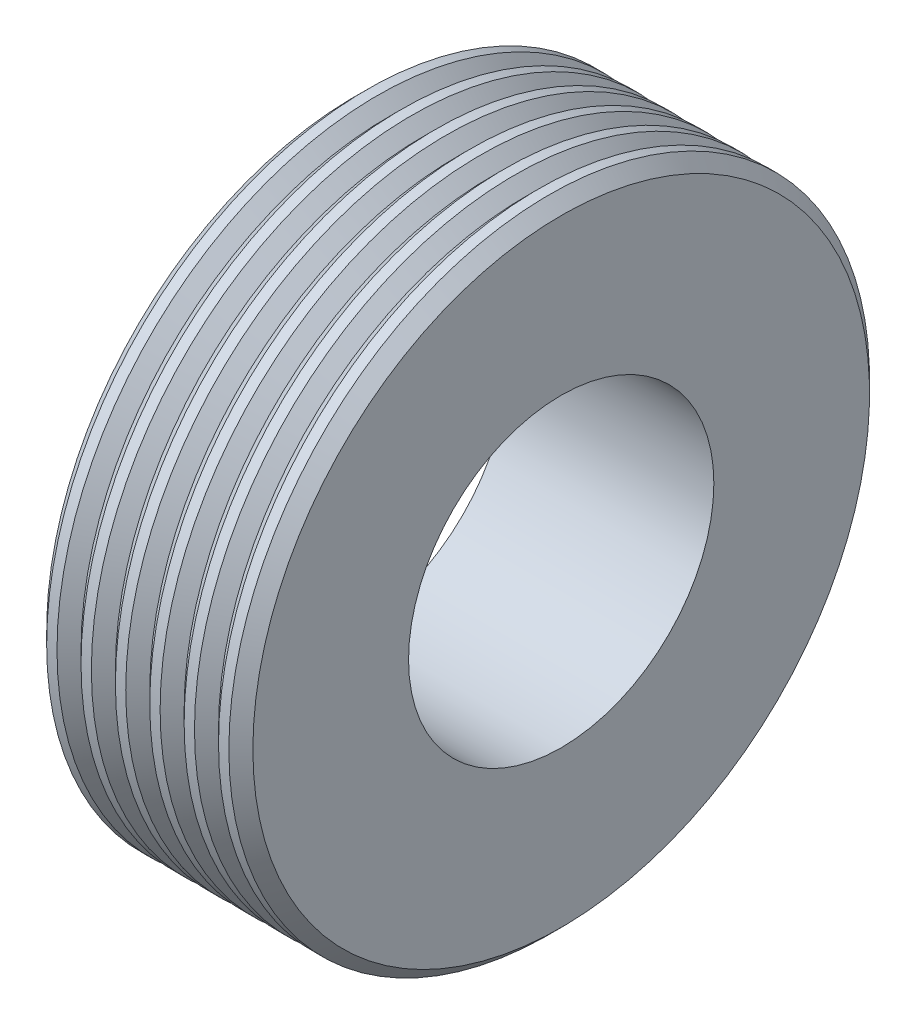
ISO-10303-21;
HEADER;
FILE_DESCRIPTION(('STEP AP214'),'2;1');
FILE_NAME('part.step','',(''),(''),'','','');
FILE_SCHEMA(('AUTOMOTIVE_DESIGN { 1 0 10303 214 1 1 1 1 }'));
ENDSEC;
DATA;
#1=APPLICATION_CONTEXT('core data for automotive mechanical design processes');
#2=APPLICATION_PROTOCOL_DEFINITION('international standard','automotive_design',2000,#1);
#3=PRODUCT_CONTEXT('',#1,'mechanical');
#4=PRODUCT('Part','Part','',(#3));
#5=PRODUCT_RELATED_PRODUCT_CATEGORY('part','',(#4));
#6=PRODUCT_DEFINITION_FORMATION('','',#4);
#7=PRODUCT_DEFINITION_CONTEXT('part definition',#1,'design');
#8=PRODUCT_DEFINITION('design','',#6,#7);
#9=PRODUCT_DEFINITION_SHAPE('','',#8);
#10=(LENGTH_UNIT() NAMED_UNIT(*) SI_UNIT(.MILLI.,.METRE.));
#11=(NAMED_UNIT(*) PLANE_ANGLE_UNIT() SI_UNIT($,.RADIAN.));
#12=(NAMED_UNIT(*) SI_UNIT($,.STERADIAN.) SOLID_ANGLE_UNIT());
#13=UNCERTAINTY_MEASURE_WITH_UNIT(LENGTH_MEASURE(1.E-05),#10,'distance_accuracy_value','');
#14=(GEOMETRIC_REPRESENTATION_CONTEXT(3) GLOBAL_UNCERTAINTY_ASSIGNED_CONTEXT((#13)) GLOBAL_UNIT_ASSIGNED_CONTEXT((#10,
#11,#12)) REPRESENTATION_CONTEXT('',''));
#15=CARTESIAN_POINT('',(0.,0.,0.));
#16=DIRECTION('',(0.,0.,1.));
#17=DIRECTION('',(1.,0.,0.));
#18=AXIS2_PLACEMENT_3D('',#15,#16,#17);
#19=CARTESIAN_POINT('',(0.,0.,0.));
#20=DIRECTION('',(-1.,0.,0.));
#21=DIRECTION('',(0.,0.,1.));
#22=AXIS2_PLACEMENT_3D('',#19,#20,#21);
#23=CYLINDRICAL_SURFACE('',#22,16.);
#24=CARTESIAN_POINT('',(-4.55,0.,0.));
#25=DIRECTION('',(1.,0.,0.));
#26=DIRECTION('',(0.,0.,-1.));
#27=AXIS2_PLACEMENT_3D('',#24,#25,#26);
#28=CIRCLE('',#27,16.);
#29=CARTESIAN_POINT('',(-4.55,0.,-16.));
#30=VERTEX_POINT('',#29);
#31=EDGE_CURVE('E53',#30,#30,#28,.T.);
#32=ORIENTED_EDGE('',*,*,#31,.T.);
#33=EDGE_LOOP('',(#32));
#34=FACE_BOUND('',#33,.T.);
#35=CARTESIAN_POINT('',(-4.03333333333333,0.,0.));
#36=DIRECTION('',(-1.,0.,0.));
#37=DIRECTION('',(0.,0.,1.));
#38=AXIS2_PLACEMENT_3D('',#35,#36,#37);
#39=CIRCLE('',#38,16.);
#40=CARTESIAN_POINT('',(-4.03333333333333,0.,16.));
#41=VERTEX_POINT('',#40);
#42=EDGE_CURVE('E64',#41,#41,#39,.T.);
#43=ORIENTED_EDGE('',*,*,#42,.T.);
#44=EDGE_LOOP('',(#43));
#45=FACE_BOUND('',#44,.T.);
#46=ADVANCED_FACE('F36',(#34,#45),#23,.T.);
#47=CARTESIAN_POINT('',(4.54999999999999,0.,0.));
#48=DIRECTION('',(-1.,0.,0.));
#49=DIRECTION('',(0.,0.,1.));
#50=AXIS2_PLACEMENT_3D('',#47,#48,#49);
#51=CIRCLE('',#50,16.);
#52=CARTESIAN_POINT('',(4.54999999999999,0.,16.));
#53=VERTEX_POINT('',#52);
#54=EDGE_CURVE('E48',#53,#53,#51,.T.);
#55=ORIENTED_EDGE('',*,*,#54,.T.);
#56=EDGE_LOOP('',(#55));
#57=FACE_BOUND('',#56,.T.);
#58=CARTESIAN_POINT('',(4.03333333333333,0.,0.));
#59=DIRECTION('',(-1.,0.,0.));
#60=DIRECTION('',(0.,0.,1.));
#61=AXIS2_PLACEMENT_3D('',#58,#59,#60);
#62=CIRCLE('',#61,16.);
#63=CARTESIAN_POINT('',(4.03333333333333,0.,16.));
#64=VERTEX_POINT('',#63);
#65=EDGE_CURVE('E70',#64,#64,#62,.T.);
#66=ORIENTED_EDGE('',*,*,#65,.F.);
#67=EDGE_LOOP('',(#66));
#68=FACE_BOUND('',#67,.T.);
#69=ADVANCED_FACE('F146',(#57,#68),#23,.T.);
#70=CARTESIAN_POINT('',(-5.14999999999999,16.,0.));
#71=DIRECTION('',(1.,0.,0.));
#72=DIRECTION('',(0.,0.,-1.));
#73=AXIS2_PLACEMENT_3D('',#70,#71,#72);
#74=PLANE('',#73);
#75=CARTESIAN_POINT('',(-5.14999999999999,0.,0.));
#76=DIRECTION('',(1.,0.,0.));
#77=DIRECTION('',(0.,0.,-1.));
#78=AXIS2_PLACEMENT_3D('',#75,#76,#77);
#79=CIRCLE('',#78,15.4);
#80=CARTESIAN_POINT('',(-5.14999999999999,0.,-15.4));
#81=VERTEX_POINT('',#80);
#82=EDGE_CURVE('E10',#81,#81,#79,.F.);
#83=ORIENTED_EDGE('',*,*,#82,.T.);
#84=EDGE_LOOP('',(#83));
#85=FACE_BOUND('',#84,.T.);
#86=CARTESIAN_POINT('',(-5.14999999999999,0.,0.));
#87=DIRECTION('',(-1.,0.,0.));
#88=DIRECTION('',(0.,0.,1.));
#89=AXIS2_PLACEMENT_3D('',#86,#87,#88);
#90=CIRCLE('',#89,7.62456140350877);
#91=CARTESIAN_POINT('',(-5.14999999999999,0.,7.62456140350877));
#92=VERTEX_POINT('',#91);
#93=EDGE_CURVE('E58',#92,#92,#90,.T.);
#94=ORIENTED_EDGE('',*,*,#93,.F.);
#95=EDGE_LOOP('',(#94));
#96=FACE_BOUND('',#95,.T.);
#97=ADVANCED_FACE('F151',(#85,#96),#74,.F.);
#98=CARTESIAN_POINT('',(0.,0.,0.));
#99=DIRECTION('',(-1.,0.,0.));
#100=DIRECTION('',(0.,0.,1.));
#101=AXIS2_PLACEMENT_3D('',#98,#99,#100);
#102=CYLINDRICAL_SURFACE('',#101,7.62456140350877);
#103=CARTESIAN_POINT('',(5.14999999999999,0.,0.));
#104=DIRECTION('',(-1.,0.,0.));
#105=DIRECTION('',(0.,0.,1.));
#106=AXIS2_PLACEMENT_3D('',#103,#104,#105);
#107=CIRCLE('',#106,7.62456140350877);
#108=CARTESIAN_POINT('',(5.14999999999999,0.,7.62456140350877));
#109=VERTEX_POINT('',#108);
#110=EDGE_CURVE('E61',#109,#109,#107,.T.);
#111=ORIENTED_EDGE('',*,*,#110,.F.);
#112=EDGE_LOOP('',(#111));
#113=FACE_BOUND('',#112,.T.);
#114=ORIENTED_EDGE('',*,*,#93,.T.);
#115=EDGE_LOOP('',(#114));
#116=FACE_BOUND('',#115,.T.);
#117=ADVANCED_FACE('F174',(#113,#116),#102,.F.);
#118=CARTESIAN_POINT('',(5.14999999999999,16.,0.));
#119=DIRECTION('',(-1.,0.,0.));
#120=DIRECTION('',(0.,0.,1.));
#121=AXIS2_PLACEMENT_3D('',#118,#119,#120);
#122=PLANE('',#121);
#123=CARTESIAN_POINT('',(5.14999999999999,0.,0.));
#124=DIRECTION('',(-1.,0.,0.));
#125=DIRECTION('',(0.,0.,1.));
#126=AXIS2_PLACEMENT_3D('',#123,#124,#125);
#127=CIRCLE('',#126,15.4);
#128=CARTESIAN_POINT('',(5.14999999999999,0.,15.4));
#129=VERTEX_POINT('',#128);
#130=EDGE_CURVE('E43',#129,#129,#127,.F.);
#131=ORIENTED_EDGE('',*,*,#130,.T.);
#132=EDGE_LOOP('',(#131));
#133=FACE_BOUND('',#132,.T.);
#134=ORIENTED_EDGE('',*,*,#110,.T.);
#135=EDGE_LOOP('',(#134));
#136=FACE_BOUND('',#135,.T.);
#137=ADVANCED_FACE('F169',(#133,#136),#122,.F.);
#138=CARTESIAN_POINT('',(4.54999999999999,0.,0.));
#139=DIRECTION('',(-1.,0.,0.));
#140=DIRECTION('',(0.,0.,1.));
#141=AXIS2_PLACEMENT_3D('',#138,#139,#140);
#142=CONICAL_SURFACE('',#141,16.,0.785398163397445);
#143=ORIENTED_EDGE('',*,*,#130,.F.);
#144=EDGE_LOOP('',(#143));
#145=FACE_BOUND('',#144,.T.);
#146=ORIENTED_EDGE('',*,*,#54,.F.);
#147=EDGE_LOOP('',(#146));
#148=FACE_BOUND('',#147,.T.);
#149=ADVANCED_FACE('F162',(#145,#148),#142,.T.);
#150=CARTESIAN_POINT('',(-5.14999999999999,0.,0.));
#151=DIRECTION('',(1.,0.,0.));
#152=DIRECTION('',(0.,0.,-1.));
#153=AXIS2_PLACEMENT_3D('',#150,#151,#152);
#154=CONICAL_SURFACE('',#153,15.4,0.785398163397451);
#155=ORIENTED_EDGE('',*,*,#31,.F.);
#156=EDGE_LOOP('',(#155));
#157=FACE_BOUND('',#156,.T.);
#158=ORIENTED_EDGE('',*,*,#82,.F.);
#159=EDGE_LOOP('',(#158));
#160=FACE_BOUND('',#159,.T.);
#161=ADVANCED_FACE('F38',(#157,#160),#154,.T.);
#162=CARTESIAN_POINT('',(2.83333333333333,0.,0.));
#163=DIRECTION('',(-1.,0.,0.));
#164=DIRECTION('',(0.,0.,1.));
#165=AXIS2_PLACEMENT_3D('',#162,#163,#164);
#166=CONICAL_SURFACE('',#165,16.,0.785398163397448);
#167=CARTESIAN_POINT('',(3.43333333333333,0.,0.));
#168=DIRECTION('',(-1.,0.,0.));
#169=DIRECTION('',(0.,0.,1.));
#170=AXIS2_PLACEMENT_3D('',#167,#168,#169);
#171=CIRCLE('',#170,15.4);
#172=CARTESIAN_POINT('',(3.43333333333333,0.,15.4));
#173=VERTEX_POINT('',#172);
#174=EDGE_CURVE('E65',#173,#173,#171,.T.);
#175=ORIENTED_EDGE('',*,*,#174,.T.);
#176=EDGE_LOOP('',(#175));
#177=FACE_BOUND('',#176,.T.);
#178=CARTESIAN_POINT('',(2.83333333333333,0.,0.));
#179=DIRECTION('',(-1.,0.,0.));
#180=DIRECTION('',(0.,0.,1.));
#181=AXIS2_PLACEMENT_3D('',#178,#179,#180);
#182=CIRCLE('',#181,16.);
#183=CARTESIAN_POINT('',(2.83333333333333,0.,16.));
#184=VERTEX_POINT('',#183);
#185=EDGE_CURVE('E74',#184,#184,#182,.T.);
#186=ORIENTED_EDGE('',*,*,#185,.F.);
#187=EDGE_LOOP('',(#186));
#188=FACE_BOUND('',#187,.T.);
#189=ADVANCED_FACE('F161',(#177,#188),#166,.T.);
#190=CARTESIAN_POINT('',(3.43333333333333,0.,0.));
#191=DIRECTION('',(1.,0.,0.));
#192=DIRECTION('',(0.,0.,-1.));
#193=AXIS2_PLACEMENT_3D('',#190,#191,#192);
#194=CONICAL_SURFACE('',#193,15.4,0.785398163397448);
#195=ORIENTED_EDGE('',*,*,#65,.T.);
#196=EDGE_LOOP('',(#195));
#197=FACE_BOUND('',#196,.T.);
#198=ORIENTED_EDGE('',*,*,#174,.F.);
#199=EDGE_LOOP('',(#198));
#200=FACE_BOUND('',#199,.T.);
#201=ADVANCED_FACE('F167',(#197,#200),#194,.T.);
#202=ORIENTED_EDGE('',*,*,#185,.T.);
#203=EDGE_LOOP('',(#202));
#204=FACE_BOUND('',#203,.T.);
#205=CARTESIAN_POINT('',(2.31666666666666,0.,0.));
#206=DIRECTION('',(-1.,0.,0.));
#207=DIRECTION('',(0.,0.,1.));
#208=AXIS2_PLACEMENT_3D('',#205,#206,#207);
#209=CIRCLE('',#208,16.);
#210=CARTESIAN_POINT('',(2.31666666666666,0.,16.));
#211=VERTEX_POINT('',#210);
#212=EDGE_CURVE('E83',#211,#211,#209,.T.);
#213=ORIENTED_EDGE('',*,*,#212,.F.);
#214=EDGE_LOOP('',(#213));
#215=FACE_BOUND('',#214,.T.);
#216=ADVANCED_FACE('F153',(#204,#215),#23,.T.);
#217=CARTESIAN_POINT('',(1.11666666666667,0.,0.));
#218=DIRECTION('',(-1.,0.,0.));
#219=DIRECTION('',(0.,0.,1.));
#220=AXIS2_PLACEMENT_3D('',#217,#218,#219);
#221=CONICAL_SURFACE('',#220,16.,0.785398163397448);
#222=CARTESIAN_POINT('',(1.71666666666667,0.,0.));
#223=DIRECTION('',(-1.,0.,0.));
#224=DIRECTION('',(0.,0.,1.));
#225=AXIS2_PLACEMENT_3D('',#222,#223,#224);
#226=CIRCLE('',#225,15.4);
#227=CARTESIAN_POINT('',(1.71666666666667,0.,15.4));
#228=VERTEX_POINT('',#227);
#229=EDGE_CURVE('E78',#228,#228,#226,.T.);
#230=ORIENTED_EDGE('',*,*,#229,.T.);
#231=EDGE_LOOP('',(#230));
#232=FACE_BOUND('',#231,.T.);
#233=CARTESIAN_POINT('',(1.11666666666667,0.,0.));
#234=DIRECTION('',(-1.,0.,0.));
#235=DIRECTION('',(0.,0.,1.));
#236=AXIS2_PLACEMENT_3D('',#233,#234,#235);
#237=CIRCLE('',#236,16.);
#238=CARTESIAN_POINT('',(1.11666666666667,0.,16.));
#239=VERTEX_POINT('',#238);
#240=EDGE_CURVE('E69',#239,#239,#237,.T.);
#241=ORIENTED_EDGE('',*,*,#240,.F.);
#242=EDGE_LOOP('',(#241));
#243=FACE_BOUND('',#242,.T.);
#244=ADVANCED_FACE('F242',(#232,#243),#221,.T.);
#245=CARTESIAN_POINT('',(1.71666666666667,0.,0.));
#246=DIRECTION('',(1.,0.,0.));
#247=DIRECTION('',(0.,0.,-1.));
#248=AXIS2_PLACEMENT_3D('',#245,#246,#247);
#249=CONICAL_SURFACE('',#248,15.4,0.785398163397448);
#250=ORIENTED_EDGE('',*,*,#212,.T.);
#251=EDGE_LOOP('',(#250));
#252=FACE_BOUND('',#251,.T.);
#253=ORIENTED_EDGE('',*,*,#229,.F.);
#254=EDGE_LOOP('',(#253));
#255=FACE_BOUND('',#254,.T.);
#256=ADVANCED_FACE('F251',(#252,#255),#249,.T.);
#257=ORIENTED_EDGE('',*,*,#240,.T.);
#258=EDGE_LOOP('',(#257));
#259=FACE_BOUND('',#258,.T.);
#260=CARTESIAN_POINT('',(0.599999999999995,0.,0.));
#261=DIRECTION('',(-1.,0.,0.));
#262=DIRECTION('',(0.,0.,1.));
#263=AXIS2_PLACEMENT_3D('',#260,#261,#262);
#264=CIRCLE('',#263,16.);
#265=CARTESIAN_POINT('',(0.599999999999995,0.,16.));
#266=VERTEX_POINT('',#265);
#267=EDGE_CURVE('E95',#266,#266,#264,.T.);
#268=ORIENTED_EDGE('',*,*,#267,.F.);
#269=EDGE_LOOP('',(#268));
#270=FACE_BOUND('',#269,.T.);
#271=ADVANCED_FACE('F144',(#259,#270),#23,.T.);
#272=CARTESIAN_POINT('',(-0.599999999999995,0.,0.));
#273=DIRECTION('',(-1.,0.,0.));
#274=DIRECTION('',(0.,0.,1.));
#275=AXIS2_PLACEMENT_3D('',#272,#273,#274);
#276=CONICAL_SURFACE('',#275,16.,0.785398163397449);
#277=CARTESIAN_POINT('',(0.,0.,0.));
#278=DIRECTION('',(-1.,0.,0.));
#279=DIRECTION('',(0.,0.,1.));
#280=AXIS2_PLACEMENT_3D('',#277,#278,#279);
#281=CIRCLE('',#280,15.4);
#282=CARTESIAN_POINT('',(0.,0.,15.4));
#283=VERTEX_POINT('',#282);
#284=EDGE_CURVE('E90',#283,#283,#281,.T.);
#285=ORIENTED_EDGE('',*,*,#284,.T.);
#286=EDGE_LOOP('',(#285));
#287=FACE_BOUND('',#286,.T.);
#288=CARTESIAN_POINT('',(-0.599999999999995,0.,0.));
#289=DIRECTION('',(-1.,0.,0.));
#290=DIRECTION('',(0.,0.,1.));
#291=AXIS2_PLACEMENT_3D('',#288,#289,#290);
#292=CIRCLE('',#291,16.);
#293=CARTESIAN_POINT('',(-0.599999999999995,0.,16.));
#294=VERTEX_POINT('',#293);
#295=EDGE_CURVE('E82',#294,#294,#292,.T.);
#296=ORIENTED_EDGE('',*,*,#295,.F.);
#297=EDGE_LOOP('',(#296));
#298=FACE_BOUND('',#297,.T.);
#299=ADVANCED_FACE('F270',(#287,#298),#276,.T.);
#300=CARTESIAN_POINT('',(0.,0.,0.));
#301=DIRECTION('',(1.,0.,0.));
#302=DIRECTION('',(0.,0.,-1.));
#303=AXIS2_PLACEMENT_3D('',#300,#301,#302);
#304=CONICAL_SURFACE('',#303,15.4,0.785398163397449);
#305=ORIENTED_EDGE('',*,*,#267,.T.);
#306=EDGE_LOOP('',(#305));
#307=FACE_BOUND('',#306,.T.);
#308=ORIENTED_EDGE('',*,*,#284,.F.);
#309=EDGE_LOOP('',(#308));
#310=FACE_BOUND('',#309,.T.);
#311=ADVANCED_FACE('F142',(#307,#310),#304,.T.);
#312=ORIENTED_EDGE('',*,*,#295,.T.);
#313=EDGE_LOOP('',(#312));
#314=FACE_BOUND('',#313,.T.);
#315=CARTESIAN_POINT('',(-1.11666666666667,0.,0.));
#316=DIRECTION('',(-1.,0.,0.));
#317=DIRECTION('',(0.,0.,1.));
#318=AXIS2_PLACEMENT_3D('',#315,#316,#317);
#319=CIRCLE('',#318,16.);
#320=CARTESIAN_POINT('',(-1.11666666666667,0.,16.));
#321=VERTEX_POINT('',#320);
#322=EDGE_CURVE('E106',#321,#321,#319,.T.);
#323=ORIENTED_EDGE('',*,*,#322,.F.);
#324=EDGE_LOOP('',(#323));
#325=FACE_BOUND('',#324,.T.);
#326=ADVANCED_FACE('F129',(#314,#325),#23,.T.);
#327=CARTESIAN_POINT('',(-2.31666666666666,0.,0.));
#328=DIRECTION('',(-1.,0.,0.));
#329=DIRECTION('',(0.,0.,1.));
#330=AXIS2_PLACEMENT_3D('',#327,#328,#329);
#331=CONICAL_SURFACE('',#330,16.,0.785398163397448);
#332=CARTESIAN_POINT('',(-1.71666666666667,0.,0.));
#333=DIRECTION('',(-1.,0.,0.));
#334=DIRECTION('',(0.,0.,1.));
#335=AXIS2_PLACEMENT_3D('',#332,#333,#334);
#336=CIRCLE('',#335,15.4);
#337=CARTESIAN_POINT('',(-1.71666666666667,0.,15.4));
#338=VERTEX_POINT('',#337);
#339=EDGE_CURVE('E102',#338,#338,#336,.T.);
#340=ORIENTED_EDGE('',*,*,#339,.T.);
#341=EDGE_LOOP('',(#340));
#342=FACE_BOUND('',#341,.T.);
#343=CARTESIAN_POINT('',(-2.31666666666666,0.,0.));
#344=DIRECTION('',(-1.,0.,0.));
#345=DIRECTION('',(0.,0.,1.));
#346=AXIS2_PLACEMENT_3D('',#343,#344,#345);
#347=CIRCLE('',#346,16.);
#348=CARTESIAN_POINT('',(-2.31666666666666,0.,16.));
#349=VERTEX_POINT('',#348);
#350=EDGE_CURVE('E94',#349,#349,#347,.T.);
#351=ORIENTED_EDGE('',*,*,#350,.F.);
#352=EDGE_LOOP('',(#351));
#353=FACE_BOUND('',#352,.T.);
#354=ADVANCED_FACE('F136',(#342,#353),#331,.T.);
#355=CARTESIAN_POINT('',(-1.71666666666667,0.,0.));
#356=DIRECTION('',(1.,0.,0.));
#357=DIRECTION('',(0.,0.,-1.));
#358=AXIS2_PLACEMENT_3D('',#355,#356,#357);
#359=CONICAL_SURFACE('',#358,15.4,0.785398163397448);
#360=ORIENTED_EDGE('',*,*,#322,.T.);
#361=EDGE_LOOP('',(#360));
#362=FACE_BOUND('',#361,.T.);
#363=ORIENTED_EDGE('',*,*,#339,.F.);
#364=EDGE_LOOP('',(#363));
#365=FACE_BOUND('',#364,.T.);
#366=ADVANCED_FACE('F126',(#362,#365),#359,.T.);
#367=ORIENTED_EDGE('',*,*,#350,.T.);
#368=EDGE_LOOP('',(#367));
#369=FACE_BOUND('',#368,.T.);
#370=CARTESIAN_POINT('',(-2.83333333333333,0.,0.));
#371=DIRECTION('',(-1.,0.,0.));
#372=DIRECTION('',(0.,0.,1.));
#373=AXIS2_PLACEMENT_3D('',#370,#371,#372);
#374=CIRCLE('',#373,16.);
#375=CARTESIAN_POINT('',(-2.83333333333333,0.,16.));
#376=VERTEX_POINT('',#375);
#377=EDGE_CURVE('E105',#376,#376,#374,.T.);
#378=ORIENTED_EDGE('',*,*,#377,.F.);
#379=EDGE_LOOP('',(#378));
#380=FACE_BOUND('',#379,.T.);
#381=ADVANCED_FACE('F123',(#369,#380),#23,.T.);
#382=CARTESIAN_POINT('',(-4.03333333333333,0.,0.));
#383=DIRECTION('',(-1.,0.,0.));
#384=DIRECTION('',(0.,0.,1.));
#385=AXIS2_PLACEMENT_3D('',#382,#383,#384);
#386=CONICAL_SURFACE('',#385,16.,0.785398163397448);
#387=CARTESIAN_POINT('',(-3.43333333333333,0.,0.));
#388=DIRECTION('',(-1.,0.,0.));
#389=DIRECTION('',(0.,0.,1.));
#390=AXIS2_PLACEMENT_3D('',#387,#388,#389);
#391=CIRCLE('',#390,15.4);
#392=CARTESIAN_POINT('',(-3.43333333333333,0.,15.4));
#393=VERTEX_POINT('',#392);
#394=EDGE_CURVE('E114',#393,#393,#391,.T.);
#395=ORIENTED_EDGE('',*,*,#394,.T.);
#396=EDGE_LOOP('',(#395));
#397=FACE_BOUND('',#396,.T.);
#398=ORIENTED_EDGE('',*,*,#42,.F.);
#399=EDGE_LOOP('',(#398));
#400=FACE_BOUND('',#399,.T.);
#401=ADVANCED_FACE('F125',(#397,#400),#386,.T.);
#402=CARTESIAN_POINT('',(-3.43333333333333,0.,0.));
#403=DIRECTION('',(1.,0.,0.));
#404=DIRECTION('',(0.,0.,-1.));
#405=AXIS2_PLACEMENT_3D('',#402,#403,#404);
#406=CONICAL_SURFACE('',#405,15.4,0.785398163397448);
#407=ORIENTED_EDGE('',*,*,#377,.T.);
#408=EDGE_LOOP('',(#407));
#409=FACE_BOUND('',#408,.T.);
#410=ORIENTED_EDGE('',*,*,#394,.F.);
#411=EDGE_LOOP('',(#410));
#412=FACE_BOUND('',#411,.T.);
#413=ADVANCED_FACE('F120',(#409,#412),#406,.T.);
#414=CLOSED_SHELL('',(#46,#69,#97,#117,#137,#149,#161,#189,#201,#216,#244,#256,#271,#299,#311,
#326,#354,#366,#381,#401,#413));
#415=MANIFOLD_SOLID_BREP('B2',#414);
#416=ADVANCED_BREP_SHAPE_REPRESENTATION('',(#18,#415),#14);
#417=SHAPE_DEFINITION_REPRESENTATION(#9,#416);
ENDSEC;
END-ISO-10303-21;
